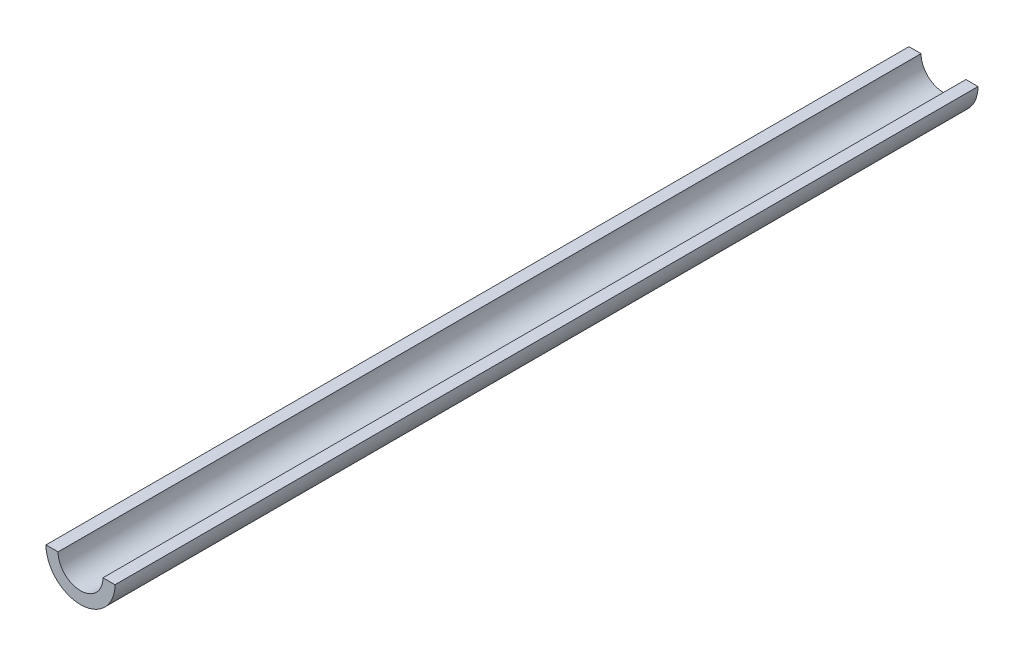
ISO-10303-21;
HEADER;
FILE_DESCRIPTION(('STEP AP214'),'2;1');
FILE_NAME('part.step','',(''),(''),'','','');
FILE_SCHEMA(('AUTOMOTIVE_DESIGN { 1 0 10303 214 1 1 1 1 }'));
ENDSEC;
DATA;
#1=APPLICATION_CONTEXT('core data for automotive mechanical design processes');
#2=APPLICATION_PROTOCOL_DEFINITION('international standard','automotive_design',2000,#1);
#3=PRODUCT_CONTEXT('',#1,'mechanical');
#4=PRODUCT('Part','Part','',(#3));
#5=PRODUCT_RELATED_PRODUCT_CATEGORY('part','',(#4));
#6=PRODUCT_DEFINITION_FORMATION('','',#4);
#7=PRODUCT_DEFINITION_CONTEXT('part definition',#1,'design');
#8=PRODUCT_DEFINITION('design','',#6,#7);
#9=PRODUCT_DEFINITION_SHAPE('','',#8);
#10=(LENGTH_UNIT() NAMED_UNIT(*) SI_UNIT(.MILLI.,.METRE.));
#11=(NAMED_UNIT(*) PLANE_ANGLE_UNIT() SI_UNIT($,.RADIAN.));
#12=(NAMED_UNIT(*) SI_UNIT($,.STERADIAN.) SOLID_ANGLE_UNIT());
#13=UNCERTAINTY_MEASURE_WITH_UNIT(LENGTH_MEASURE(1.E-05),#10,'distance_accuracy_value','');
#14=(GEOMETRIC_REPRESENTATION_CONTEXT(3) GLOBAL_UNCERTAINTY_ASSIGNED_CONTEXT((#13)) GLOBAL_UNIT_ASSIGNED_CONTEXT((#10,
#11,#12)) REPRESENTATION_CONTEXT('',''));
#15=CARTESIAN_POINT('',(0.,0.,0.));
#16=DIRECTION('',(0.,0.,1.));
#17=DIRECTION('',(1.,0.,0.));
#18=AXIS2_PLACEMENT_3D('',#15,#16,#17);
#19=CARTESIAN_POINT('',(0.,0.,250.));
#20=DIRECTION('',(0.,0.,-1.));
#21=DIRECTION('',(-1.,0.,0.));
#22=AXIS2_PLACEMENT_3D('',#19,#20,#21);
#23=CYLINDRICAL_SURFACE('',#22,6.5);
#24=CARTESIAN_POINT('',(0.,0.,0.));
#25=DIRECTION('',(0.,0.,-1.));
#26=DIRECTION('',(1.,0.,0.));
#27=AXIS2_PLACEMENT_3D('',#24,#25,#26);
#28=CIRCLE('',#27,6.5);
#29=CARTESIAN_POINT('',(6.5,0.,0.));
#30=VERTEX_POINT('',#29);
#31=CARTESIAN_POINT('',(-6.5,0.,0.));
#32=VERTEX_POINT('',#31);
#33=EDGE_CURVE('E113',#30,#32,#28,.T.);
#34=ORIENTED_EDGE('',*,*,#33,.T.);
#35=DIRECTION('',(0.,0.,-1.));
#36=VECTOR('',#35,1.);
#37=CARTESIAN_POINT('',(-6.5,0.,250.));
#38=LINE('',#37,#36);
#39=CARTESIAN_POINT('',(-6.5,0.,250.));
#40=VERTEX_POINT('',#39);
#41=EDGE_CURVE('E11',#40,#32,#38,.T.);
#42=ORIENTED_EDGE('',*,*,#41,.F.);
#43=CARTESIAN_POINT('',(0.,0.,250.));
#44=DIRECTION('',(0.,0.,-1.));
#45=DIRECTION('',(1.,0.,0.));
#46=AXIS2_PLACEMENT_3D('',#43,#44,#45);
#47=CIRCLE('',#46,6.5);
#48=CARTESIAN_POINT('',(6.5,0.,250.));
#49=VERTEX_POINT('',#48);
#50=EDGE_CURVE('E97',#49,#40,#47,.T.);
#51=ORIENTED_EDGE('',*,*,#50,.F.);
#52=DIRECTION('',(0.,0.,-1.));
#53=VECTOR('',#52,1.);
#54=CARTESIAN_POINT('',(6.5,0.,250.));
#55=LINE('',#54,#53);
#56=EDGE_CURVE('E109',#49,#30,#55,.T.);
#57=ORIENTED_EDGE('',*,*,#56,.T.);
#58=EDGE_LOOP('',(#34,#42,#51,#57));
#59=FACE_BOUND('',#58,.T.);
#60=ADVANCED_FACE('F45',(#59),#23,.F.);
#61=CARTESIAN_POINT('',(-10.,0.,250.));
#62=DIRECTION('',(0.,-1.,0.));
#63=DIRECTION('',(0.,0.,-1.));
#64=AXIS2_PLACEMENT_3D('',#61,#62,#63);
#65=PLANE('',#64);
#66=DIRECTION('',(-1.,0.,0.));
#67=VECTOR('',#66,1.);
#68=CARTESIAN_POINT('',(-10.,0.,0.));
#69=LINE('',#68,#67);
#70=CARTESIAN_POINT('',(-10.,0.,0.));
#71=VERTEX_POINT('',#70);
#72=EDGE_CURVE('E102',#32,#71,#69,.T.);
#73=ORIENTED_EDGE('',*,*,#72,.T.);
#74=DIRECTION('',(0.,0.,-1.));
#75=VECTOR('',#74,1.);
#76=CARTESIAN_POINT('',(-10.,0.,250.));
#77=LINE('',#76,#75);
#78=CARTESIAN_POINT('',(-10.,0.,250.));
#79=VERTEX_POINT('',#78);
#80=EDGE_CURVE('E54',#79,#71,#77,.T.);
#81=ORIENTED_EDGE('',*,*,#80,.F.);
#82=DIRECTION('',(-1.,0.,0.));
#83=VECTOR('',#82,1.);
#84=CARTESIAN_POINT('',(-10.,0.,250.));
#85=LINE('',#84,#83);
#86=EDGE_CURVE('E92',#40,#79,#85,.T.);
#87=ORIENTED_EDGE('',*,*,#86,.F.);
#88=ORIENTED_EDGE('',*,*,#41,.T.);
#89=EDGE_LOOP('',(#73,#81,#87,#88));
#90=FACE_BOUND('',#89,.T.);
#91=ADVANCED_FACE('F101',(#90),#65,.F.);
#92=CARTESIAN_POINT('',(0.,0.,250.));
#93=DIRECTION('',(0.,0.,-1.));
#94=DIRECTION('',(-1.,0.,0.));
#95=AXIS2_PLACEMENT_3D('',#92,#93,#94);
#96=CYLINDRICAL_SURFACE('',#95,10.);
#97=CARTESIAN_POINT('',(0.,0.,0.));
#98=DIRECTION('',(0.,0.,1.));
#99=DIRECTION('',(1.,0.,0.));
#100=AXIS2_PLACEMENT_3D('',#97,#98,#99);
#101=CIRCLE('',#100,10.);
#102=CARTESIAN_POINT('',(10.,0.,0.));
#103=VERTEX_POINT('',#102);
#104=EDGE_CURVE('E79',#71,#103,#101,.T.);
#105=ORIENTED_EDGE('',*,*,#104,.T.);
#106=DIRECTION('',(0.,0.,-1.));
#107=VECTOR('',#106,1.);
#108=CARTESIAN_POINT('',(10.,0.,250.));
#109=LINE('',#108,#107);
#110=CARTESIAN_POINT('',(10.,0.,250.));
#111=VERTEX_POINT('',#110);
#112=EDGE_CURVE('E104',#111,#103,#109,.T.);
#113=ORIENTED_EDGE('',*,*,#112,.F.);
#114=CARTESIAN_POINT('',(0.,0.,250.));
#115=DIRECTION('',(0.,0.,1.));
#116=DIRECTION('',(1.,0.,0.));
#117=AXIS2_PLACEMENT_3D('',#114,#115,#116);
#118=CIRCLE('',#117,10.);
#119=EDGE_CURVE('E95',#79,#111,#118,.T.);
#120=ORIENTED_EDGE('',*,*,#119,.F.);
#121=ORIENTED_EDGE('',*,*,#80,.T.);
#122=EDGE_LOOP('',(#105,#113,#120,#121));
#123=FACE_BOUND('',#122,.T.);
#124=ADVANCED_FACE('F105',(#123),#96,.T.);
#125=CARTESIAN_POINT('',(6.5,0.,250.));
#126=DIRECTION('',(0.,-1.,0.));
#127=DIRECTION('',(0.,0.,-1.));
#128=AXIS2_PLACEMENT_3D('',#125,#126,#127);
#129=PLANE('',#128);
#130=DIRECTION('',(-1.,0.,0.));
#131=VECTOR('',#130,1.);
#132=CARTESIAN_POINT('',(6.5,0.,0.));
#133=LINE('',#132,#131);
#134=EDGE_CURVE('E85',#103,#30,#133,.T.);
#135=ORIENTED_EDGE('',*,*,#134,.T.);
#136=ORIENTED_EDGE('',*,*,#56,.F.);
#137=DIRECTION('',(-1.,0.,0.));
#138=VECTOR('',#137,1.);
#139=CARTESIAN_POINT('',(6.5,0.,250.));
#140=LINE('',#139,#138);
#141=EDGE_CURVE('E62',#111,#49,#140,.T.);
#142=ORIENTED_EDGE('',*,*,#141,.F.);
#143=ORIENTED_EDGE('',*,*,#112,.T.);
#144=EDGE_LOOP('',(#135,#136,#142,#143));
#145=FACE_BOUND('',#144,.T.);
#146=ADVANCED_FACE('F126',(#145),#129,.F.);
#147=CARTESIAN_POINT('',(0.,0.,250.));
#148=DIRECTION('',(0.,0.,1.));
#149=DIRECTION('',(1.,0.,0.));
#150=AXIS2_PLACEMENT_3D('',#147,#148,#149);
#151=PLANE('',#150);
#152=ORIENTED_EDGE('',*,*,#50,.T.);
#153=ORIENTED_EDGE('',*,*,#86,.T.);
#154=ORIENTED_EDGE('',*,*,#119,.T.);
#155=ORIENTED_EDGE('',*,*,#141,.T.);
#156=EDGE_LOOP('',(#152,#153,#154,#155));
#157=FACE_BOUND('',#156,.T.);
#158=ADVANCED_FACE('F93',(#157),#151,.T.);
#159=CARTESIAN_POINT('',(0.,0.,0.));
#160=DIRECTION('',(0.,0.,1.));
#161=DIRECTION('',(1.,0.,0.));
#162=AXIS2_PLACEMENT_3D('',#159,#160,#161);
#163=PLANE('',#162);
#164=ORIENTED_EDGE('',*,*,#33,.F.);
#165=ORIENTED_EDGE('',*,*,#134,.F.);
#166=ORIENTED_EDGE('',*,*,#104,.F.);
#167=ORIENTED_EDGE('',*,*,#72,.F.);
#168=EDGE_LOOP('',(#164,#165,#166,#167));
#169=FACE_BOUND('',#168,.T.);
#170=ADVANCED_FACE('F129',(#169),#163,.F.);
#171=CLOSED_SHELL('',(#60,#91,#124,#146,#158,#170));
#172=MANIFOLD_SOLID_BREP('B2',#171);
#173=ADVANCED_BREP_SHAPE_REPRESENTATION('',(#18,#172),#14);
#174=SHAPE_DEFINITION_REPRESENTATION(#9,#173);
ENDSEC;
END-ISO-10303-21;
